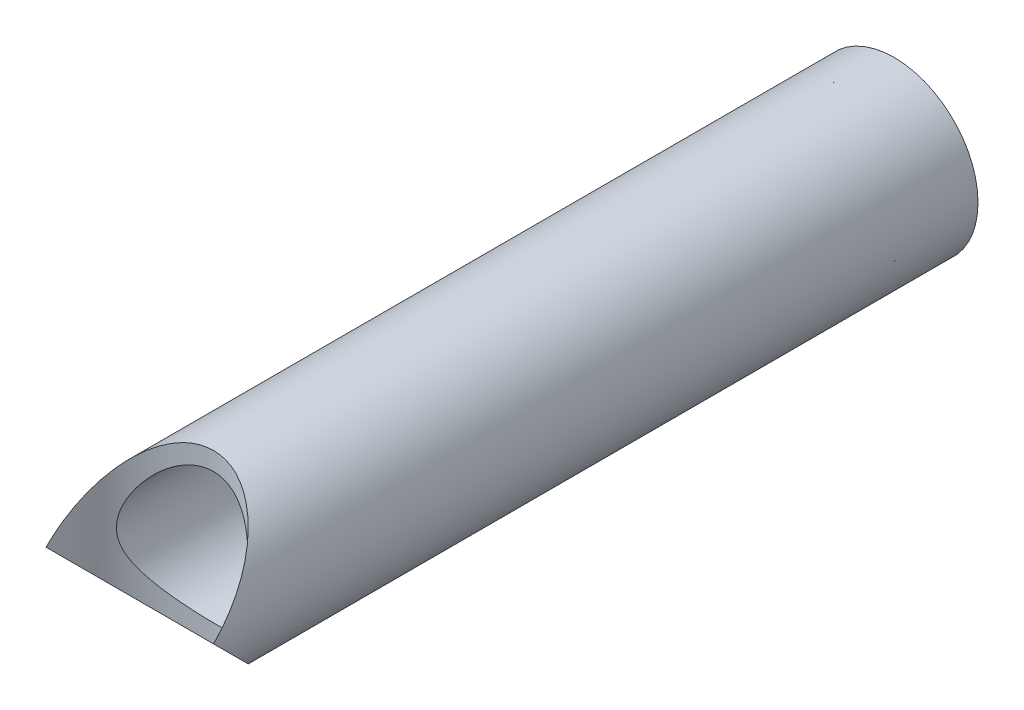
ISO-10303-21;
HEADER;
FILE_DESCRIPTION(('STEP AP214'),'2;1');
FILE_NAME('part.step','',(''),(''),'','','');
FILE_SCHEMA(('AUTOMOTIVE_DESIGN { 1 0 10303 214 1 1 1 1 }'));
ENDSEC;
DATA;
#1=APPLICATION_CONTEXT('core data for automotive mechanical design processes');
#2=APPLICATION_PROTOCOL_DEFINITION('international standard','automotive_design',2000,#1);
#3=PRODUCT_CONTEXT('',#1,'mechanical');
#4=PRODUCT('Part','Part','',(#3));
#5=PRODUCT_RELATED_PRODUCT_CATEGORY('part','',(#4));
#6=PRODUCT_DEFINITION_FORMATION('','',#4);
#7=PRODUCT_DEFINITION_CONTEXT('part definition',#1,'design');
#8=PRODUCT_DEFINITION('design','',#6,#7);
#9=PRODUCT_DEFINITION_SHAPE('','',#8);
#10=(LENGTH_UNIT() NAMED_UNIT(*) SI_UNIT(.MILLI.,.METRE.));
#11=(NAMED_UNIT(*) PLANE_ANGLE_UNIT() SI_UNIT($,.RADIAN.));
#12=(NAMED_UNIT(*) SI_UNIT($,.STERADIAN.) SOLID_ANGLE_UNIT());
#13=UNCERTAINTY_MEASURE_WITH_UNIT(LENGTH_MEASURE(1.E-05),#10,'distance_accuracy_value','');
#14=(GEOMETRIC_REPRESENTATION_CONTEXT(3) GLOBAL_UNCERTAINTY_ASSIGNED_CONTEXT((#13)) GLOBAL_UNIT_ASSIGNED_CONTEXT((#10,
#11,#12)) REPRESENTATION_CONTEXT('',''));
#15=CARTESIAN_POINT('',(0.,0.,0.));
#16=DIRECTION('',(0.,0.,1.));
#17=DIRECTION('',(1.,0.,0.));
#18=AXIS2_PLACEMENT_3D('',#15,#16,#17);
#19=CARTESIAN_POINT('',(0.,0.,0.));
#20=DIRECTION('',(0.,0.,1.));
#21=DIRECTION('',(1.,0.,0.));
#22=AXIS2_PLACEMENT_3D('',#19,#20,#21);
#23=CYLINDRICAL_SURFACE('',#22,13.0683);
#24=CARTESIAN_POINT('',(0.,0.,0.));
#25=DIRECTION('',(0.,0.,-1.));
#26=DIRECTION('',(1.,0.,0.));
#27=AXIS2_PLACEMENT_3D('',#24,#25,#26);
#28=CIRCLE('',#27,13.0683);
#29=CARTESIAN_POINT('',(13.0683,0.,0.));
#30=VERTEX_POINT('',#29);
#31=CARTESIAN_POINT('',(-13.0683,0.,0.));
#32=VERTEX_POINT('',#31);
#33=EDGE_CURVE('E52',#30,#32,#28,.T.);
#34=ORIENTED_EDGE('',*,*,#33,.T.);
#35=CARTESIAN_POINT('',(0.,0.,0.));
#36=DIRECTION('',(0.,0.,-1.));
#37=DIRECTION('',(-1.,0.,0.));
#38=AXIS2_PLACEMENT_3D('',#35,#36,#37);
#39=CIRCLE('',#38,13.0683);
#40=EDGE_CURVE('E50',#32,#30,#39,.T.);
#41=ORIENTED_EDGE('',*,*,#40,.T.);
#42=EDGE_LOOP('',(#34,#41));
#43=FACE_BOUND('',#42,.T.);
#44=CARTESIAN_POINT('',(3.36137327163763E-12,13.0683,135.6995));
#45=CARTESIAN_POINT('',(-0.31564780553952,13.0682969442648,135.699502969259));
#46=CARTESIAN_POINT('',(-0.631365008771418,13.056842753139,135.708470121774));
#47=CARTESIAN_POINT('',(-1.26028077621582,13.0112130982685,135.744139015985));
#48=CARTESIAN_POINT('',(-1.5734777792293,12.9770245058517,135.770851004967));
#49=CARTESIAN_POINT('',(-2.19534481022483,12.8864214411206,135.841458842086));
#50=CARTESIAN_POINT('',(-2.50400399603749,12.8299606179479,135.885390525));
#51=CARTESIAN_POINT('',(-3.11380537882932,12.6957534246509,135.989436448515));
#52=CARTESIAN_POINT('',(-3.41494850800069,12.6180097086339,136.049548671287));
#53=CARTESIAN_POINT('',(-4.00595259693765,12.4429577520778,136.18425671896));
#54=CARTESIAN_POINT('',(-4.29587320366963,12.3457772894036,136.258757846191));
#55=CARTESIAN_POINT('',(-4.86492993416844,12.1328163268632,136.421054002579));
#56=CARTESIAN_POINT('',(-5.14406595356887,12.0170356470519,136.508849160346));
#57=CARTESIAN_POINT('',(-5.69031348187373,11.7682136015384,136.696166691747));
#58=CARTESIAN_POINT('',(-5.95742862166305,11.6351774955834,136.79568549097));
#59=CARTESIAN_POINT('',(-6.47892014237298,11.3530605619995,137.004894668748));
#60=CARTESIAN_POINT('',(-6.73329396013967,11.203976524875,137.114587081359));
#61=CARTESIAN_POINT('',(-7.31223234219363,10.8381378046672,137.380983949751));
#62=CARTESIAN_POINT('',(-7.63155006646832,10.6155133742641,137.541070577886));
#63=CARTESIAN_POINT('',(-8.24547311458336,10.1460374956556,137.872760295247));
#64=CARTESIAN_POINT('',(-8.54007077997845,9.899178590464,138.044366924026));
#65=CARTESIAN_POINT('',(-9.10477595697104,9.38245112110175,138.395693278953));
#66=CARTESIAN_POINT('',(-9.37481652900868,9.11252333835956,138.575433291915));
#67=CARTESIAN_POINT('',(-9.88918263027681,8.55157007025901,138.938578776537));
#68=CARTESIAN_POINT('',(-10.133510915295,8.26054685152197,139.121983852872));
#69=CARTESIAN_POINT('',(-10.5993931775722,7.65386726760582,139.490738600406));
#70=CARTESIAN_POINT('',(-10.8205777741854,7.33792160620142,139.676079261557));
#71=CARTESIAN_POINT('',(-11.2355859425544,6.68518438670586,140.041009360853));
#72=CARTESIAN_POINT('',(-11.42940122959,6.34838656082913,140.220597044902));
#73=CARTESIAN_POINT('',(-11.7879460175653,5.65480664728864,140.567289588585));
#74=CARTESIAN_POINT('',(-11.9527504284089,5.2980792578665,140.734425935083));
#75=CARTESIAN_POINT('',(-12.2518791744831,4.56385593405592,141.048999452263));
#76=CARTESIAN_POINT('',(-12.3862295914749,4.18637811792706,141.196453434699));
#77=CARTESIAN_POINT('',(-12.5750560935809,3.56486571257676,141.409721166144));
#78=CARTESIAN_POINT('',(-12.6400970206891,3.32716405933401,141.484745147665));
#79=CARTESIAN_POINT('',(-12.7572707770035,2.84499670838633,141.621926155231));
#80=CARTESIAN_POINT('',(-12.809408625479,2.60053368211279,141.684088183));
#81=CARTESIAN_POINT('',(-12.8998453779524,2.10649497289366,141.793129176676));
#82=CARTESIAN_POINT('',(-12.9381865623535,1.85693742999744,141.840054791221));
#83=CARTESIAN_POINT('',(-13.0004871186682,1.3535247374254,141.916846370317));
#84=CARTESIAN_POINT('',(-13.0244556169586,1.09967242037962,141.946723159958));
#85=CARTESIAN_POINT('',(-13.0500620747704,0.704367963353698,141.978734766559));
#86=CARTESIAN_POINT('',(-13.0568951124878,0.563734221147244,141.987303372601));
#87=CARTESIAN_POINT('',(-13.066015590108,0.282076624535581,141.998750883677));
#88=CARTESIAN_POINT('',(-13.0683025231652,0.141052728387061,142.001629154296));
#89=CARTESIAN_POINT('',(-13.0682946581523,-0.298625785103751,142.001611300705));
#90=CARTESIAN_POINT('',(-13.0580275062785,-0.597380802184784,141.988672506161));
#91=CARTESIAN_POINT('',(-13.0172809420248,-1.19151526642505,141.937777479124));
#92=CARTESIAN_POINT('',(-12.986783216413,-1.48689140827512,141.899798579878));
#93=CARTESIAN_POINT('',(-12.9063421091523,-2.07231103930122,141.801081493142));
#94=CARTESIAN_POINT('',(-12.856319839576,-2.36232783117924,141.740251012926));
#95=CARTESIAN_POINT('',(-12.7380543838856,-2.93388475222846,141.599208239853));
#96=CARTESIAN_POINT('',(-12.6698025933016,-3.21542080841676,141.51898679602));
#97=CARTESIAN_POINT('',(-12.5461763890537,-3.66125403934763,141.377057694173));
#98=CARTESIAN_POINT('',(-12.496088619489,-3.82863570209849,141.32025245754));
#99=CARTESIAN_POINT('',(-12.3898633712997,-4.15955890512076,141.201592445757));
#100=CARTESIAN_POINT('',(-12.3337283278525,-4.32310195909032,141.139739705601));
#101=CARTESIAN_POINT('',(-12.1565275399193,-4.80810290194966,140.947671279435));
#102=CARTESIAN_POINT('',(-12.0266922649779,-5.12383921554589,140.810975930741));
#103=CARTESIAN_POINT('',(-11.7451465837632,-5.73993257030188,140.525723389227));
#104=CARTESIAN_POINT('',(-11.5934223437037,-6.04027972163225,140.377158721715));
#105=CARTESIAN_POINT('',(-11.2691749683943,-6.62556031042074,140.072719200988));
#106=CARTESIAN_POINT('',(-11.0966541807886,-6.91049548242836,139.916845174111));
#107=CARTESIAN_POINT('',(-10.7262447064065,-7.47293364606091,139.59703347216));
#108=CARTESIAN_POINT('',(-10.5277732368094,-7.74999349211534,139.432992587972));
#109=CARTESIAN_POINT('',(-10.1099134370845,-8.28770423264776,139.104625765304));
#110=CARTESIAN_POINT('',(-9.89052421472926,-8.54835442639909,138.940299814957));
#111=CARTESIAN_POINT('',(-9.43125525755181,-9.05251764445008,138.614597156252));
#112=CARTESIAN_POINT('',(-9.19138996045186,-9.29604252645507,138.453218465662));
#113=CARTESIAN_POINT('',(-8.69126604027603,-9.76523953752508,138.136191052004));
#114=CARTESIAN_POINT('',(-8.43100868316629,-9.99091277309879,137.980541974114));
#115=CARTESIAN_POINT('',(-7.90269160886927,-10.4133108834985,137.684646654151));
#116=CARTESIAN_POINT('',(-7.63552456386915,-10.6108854056376,137.544021860343));
#117=CARTESIAN_POINT('',(-7.08334887878585,-10.9871845115405,137.272956851186));
#118=CARTESIAN_POINT('',(-6.7983426102416,-11.1659115924298,137.142515287242));
#119=CARTESIAN_POINT('',(-6.21137507066658,-11.5027695684634,136.894291658284));
#120=CARTESIAN_POINT('',(-5.90942420970475,-11.6609129153918,136.776501947352));
#121=CARTESIAN_POINT('',(-5.28957802080575,-11.9548489529339,136.555909170406));
#122=CARTESIAN_POINT('',(-4.97168544230581,-12.090645480481,136.453103531983));
#123=CARTESIAN_POINT('',(-4.37171935268185,-12.318891758693,136.279307013));
#124=CARTESIAN_POINT('',(-4.09167000139884,-12.414796390822,136.205854795481));
#125=CARTESIAN_POINT('',(-3.52273449095137,-12.5880575222772,136.072650078347));
#126=CARTESIAN_POINT('',(-3.23384996377672,-12.665417424039,136.012895065769));
#127=CARTESIAN_POINT('',(-2.64901186733749,-12.8005166112199,135.908255535957));
#128=CARTESIAN_POINT('',(-2.35306160047254,-12.8582648777987,135.863364212125));
#129=CARTESIAN_POINT('',(-1.7559307699453,-12.9533224670306,135.78934355005));
#130=CARTESIAN_POINT('',(-1.45475014772709,-12.9906315607068,135.760214388387));
#131=CARTESIAN_POINT('',(-0.848445588864123,-13.0442901753827,135.718289678277));
#132=CARTESIAN_POINT('',(-0.543312343535124,-13.0605745796989,135.705544875217));
#133=CARTESIAN_POINT('',(0.0675867605515304,-13.0716955997113,135.696843141743));
#134=CARTESIAN_POINT('',(0.373352620634617,-13.0665321704252,135.700886246537));
#135=CARTESIAN_POINT('',(0.983120352512098,-13.0348440508523,135.72566948873));
#136=CARTESIAN_POINT('',(1.28712203471024,-13.0083171059325,135.746411388462));
#137=CARTESIAN_POINT('',(1.89099369342511,-12.9343396581425,135.804131752536));
#138=CARTESIAN_POINT('',(2.19086373691274,-12.8868894948351,135.841109953377));
#139=CARTESIAN_POINT('',(2.77060297518347,-12.7744803282548,135.928436833816));
#140=CARTESIAN_POINT('',(3.0507556617447,-12.7104329095573,135.978087798625));
#141=CARTESIAN_POINT('',(3.60375454323894,-12.5648386714092,136.090516036047));
#142=CARTESIAN_POINT('',(3.87660102046779,-12.4832925291712,136.15329280068));
#143=CARTESIAN_POINT('',(4.41364183376353,-12.3036744693156,136.290893588468));
#144=CARTESIAN_POINT('',(4.67783654277909,-12.2056032651608,136.365717091503));
#145=CARTESIAN_POINT('',(5.19660539862226,-11.9939268113875,136.526255746571));
#146=CARTESIAN_POINT('',(5.45117599484282,-11.8803158987558,136.611974868398));
#147=CARTESIAN_POINT('',(5.97537729842836,-11.6262054882184,136.802336982984));
#148=CARTESIAN_POINT('',(6.24387251429642,-11.4841430940847,136.908019250924));
#149=CARTESIAN_POINT('',(6.7673521426863,-11.1836731332719,137.129425036735));
#150=CARTESIAN_POINT('',(7.02233087203493,-11.0252587724294,137.245152725227));
#151=CARTESIAN_POINT('',(7.51825675091115,-10.6932395910639,137.48496013497));
#152=CARTESIAN_POINT('',(7.75919694842359,-10.5196273491222,137.60904392977));
#153=CARTESIAN_POINT('',(8.22650191929636,-10.1583631545659,137.86376335239));
#154=CARTESIAN_POINT('',(8.45287021153358,-9.97071461533043,137.994397384777));
#155=CARTESIAN_POINT('',(8.9357665214004,-9.54237771793472,138.287803623669));
#156=CARTESIAN_POINT('',(9.18897661325485,-9.29869737911008,138.451678518201));
#157=CARTESIAN_POINT('',(9.67380527379591,-8.79321570530231,138.783447810965));
#158=CARTESIAN_POINT('',(9.90542001652405,-8.53141117359315,138.951342914844));
#159=CARTESIAN_POINT('',(10.3469490904287,-7.99019302249321,139.288002978288));
#160=CARTESIAN_POINT('',(10.556845597608,-7.71076523779836,139.45676853484));
#161=CARTESIAN_POINT('',(10.954308658815,-7.13484361200697,139.791381364076));
#162=CARTESIAN_POINT('',(11.1418787125962,-6.83835245649441,139.957229090656));
#163=CARTESIAN_POINT('',(11.4677816427466,-6.2737747617432,140.257585819858));
#164=CARTESIAN_POINT('',(11.6092861929374,-6.00804213623112,140.393081159966));
#165=CARTESIAN_POINT('',(11.8750146485658,-5.46407508545593,140.655825917802));
#166=CARTESIAN_POINT('',(11.9992380052857,-5.18584026359024,140.783075073627));
#167=CARTESIAN_POINT('',(12.2292962944617,-4.61721973861089,141.025515080087));
#168=CARTESIAN_POINT('',(12.3351548671055,-4.32685026279119,141.140721355877));
#169=CARTESIAN_POINT('',(12.527382977472,-3.73392336801811,141.354996254377));
#170=CARTESIAN_POINT('',(12.6137578251822,-3.43136929634343,141.454069271906));
#171=CARTESIAN_POINT('',(12.7510062943901,-2.87372809830761,141.614478261923));
#172=CARTESIAN_POINT('',(12.8055080558348,-2.62057101822486,141.679407756826));
#173=CARTESIAN_POINT('',(12.8998045602244,-2.10793433579588,141.7930582949));
#174=CARTESIAN_POINT('',(12.9396016868935,-1.8484557654833,141.841781965021));
#175=CARTESIAN_POINT('',(13.0035753094257,-1.32541056026687,141.920671404583));
#176=CARTESIAN_POINT('',(13.0277901277568,-1.06185559977626,141.95088269377));
#177=CARTESIAN_POINT('',(13.0601538672831,-0.532207658816483,141.991361454328));
#178=CARTESIAN_POINT('',(13.0683020008264,-0.266114554560085,142.001627947926));
#179=CARTESIAN_POINT('',(13.0682977523581,0.298941600010746,142.001618347765));
#180=CARTESIAN_POINT('',(13.0580106011922,0.597910268814965,141.988651961476));
#181=CARTESIAN_POINT('',(13.017207382444,1.19230387725092,141.937685013321));
#182=CARTESIAN_POINT('',(12.9866875266984,1.48772814271757,141.899679763444));
#183=CARTESIAN_POINT('',(12.9062225288805,2.07303999689914,141.800936130446));
#184=CARTESIAN_POINT('',(12.8562107408035,2.36290497093408,141.740119779694));
#185=CARTESIAN_POINT('',(12.7379856829849,2.93416677021101,141.599127426573));
#186=CARTESIAN_POINT('',(12.6697640247615,3.21555962607535,141.518942503581));
#187=CARTESIAN_POINT('',(12.5461786763486,3.66124595721019,141.377060328558));
#188=CARTESIAN_POINT('',(12.4960934803285,3.82861950275147,141.320257972479));
#189=CARTESIAN_POINT('',(12.3898738191056,4.159527412667,141.201604031451));
#190=CARTESIAN_POINT('',(12.3337417722674,4.32306328023996,141.139754467455));
#191=CARTESIAN_POINT('',(12.1565565035085,4.80802739231456,140.947702295194));
#192=CARTESIAN_POINT('',(12.02673566216,5.12373529231011,140.811021350693));
#193=CARTESIAN_POINT('',(11.7452003095866,5.73982397073153,140.525776369451));
#194=CARTESIAN_POINT('',(11.5934684872021,6.0401923735072,140.377202978632));
#195=CARTESIAN_POINT('',(11.2692013457305,6.62551675317796,140.072743034951));
#196=CARTESIAN_POINT('',(11.0966681383198,6.91047429027766,139.916857225398));
#197=CARTESIAN_POINT('',(10.7262382023385,7.47294352066721,139.597027856186));
#198=CARTESIAN_POINT('',(10.5277594938107,7.75001267866947,139.432981229814));
#199=CARTESIAN_POINT('',(10.1098842438606,8.28774029728535,139.104603383071));
#200=CARTESIAN_POINT('',(9.89048685707299,8.54839809397604,138.940272151463));
#201=CARTESIAN_POINT('',(9.43121518290503,9.05255898147539,138.614569903909));
#202=CARTESIAN_POINT('',(9.19135667378726,9.29607503104374,138.453196721517));
#203=CARTESIAN_POINT('',(8.69124810567226,9.76525508688709,138.136180327122));
#204=CARTESIAN_POINT('',(8.43099935003906,9.99092023235888,137.980536749811));
#205=CARTESIAN_POINT('',(7.90276196554676,10.4132546347909,137.684686056137));
#206=CARTESIAN_POINT('',(7.63567030289562,10.6107776319754,137.544098564058));
#207=CARTESIAN_POINT('',(7.08361127947601,10.9870141361177,137.27308050964));
#208=CARTESIAN_POINT('',(6.79864346433928,11.1657271646624,137.142650205662));
#209=CARTESIAN_POINT('',(6.21166037281008,11.5026175839761,136.894404630177));
#210=CARTESIAN_POINT('',(5.90964989980054,11.6608007199194,136.776585831035));
#211=CARTESIAN_POINT('',(5.28968877171061,11.9548015994657,136.555945024658));
#212=CARTESIAN_POINT('',(4.97174148424563,12.090624042344,136.453119866912));
#213=CARTESIAN_POINT('',(4.37276977744862,12.3184922429555,136.279611212162));
#214=CARTESIAN_POINT('',(4.09381050493677,12.4140634782819,136.206416085422));
#215=CARTESIAN_POINT('',(3.52711249026061,12.5868043521595,136.073615684011));
#216=CARTESIAN_POINT('',(3.23937529932706,12.6639772210581,136.014008023762));
#217=CARTESIAN_POINT('',(2.65738401671252,12.7987423807872,135.909632218031));
#218=CARTESIAN_POINT('',(2.36314553103273,12.856377069044,135.864831946197));
#219=CARTESIAN_POINT('',(1.76959286456039,12.951418903898,135.790828047905));
#220=CARTESIAN_POINT('',(1.47028134738084,12.9888363458368,135.761616483216));
#221=CARTESIAN_POINT('',(0.975438578513692,13.0333031988691,135.726874365648));
#222=CARTESIAN_POINT('',(0.780753926935836,13.0464165998793,135.716619313547));
#223=CARTESIAN_POINT('',(0.390721783708617,13.0639166845106,135.702930634628));
#224=CARTESIAN_POINT('',(0.195374185493276,13.0683018913858,135.69949816214));
#225=CARTESIAN_POINT('',(3.36137327163763E-12,13.0683,135.6995));
#226=B_SPLINE_CURVE_WITH_KNOTS('',3,(#44,#45,#46,#47,#48,#49,#50,#51,#52,#53,#54,#55,#56,#57,
#58,#59,#60,#61,#62,#63,#64,#65,#66,#67,#68,#69,#70,#71,#72,#73,#74,#75,#76,#77,#78,#79,#80,#81,
#82,#83,#84,#85,#86,#87,#88,#89,#90,#91,#92,#93,#94,#95,#96,#97,#98,#99,#100,#101,#102,#103,
#104,#105,#106,#107,#108,#109,#110,#111,#112,#113,#114,#115,#116,#117,#118,#119,#120,#121,#122,
#123,#124,#125,#126,#127,#128,#129,#130,#131,#132,#133,#134,#135,#136,#137,#138,#139,#140,#141,
#142,#143,#144,#145,#146,#147,#148,#149,#150,#151,#152,#153,#154,#155,#156,#157,#158,#159,#160,
#161,#162,#163,#164,#165,#166,#167,#168,#169,#170,#171,#172,#173,#174,#175,#176,#177,#178,#179,
#180,#181,#182,#183,#184,#185,#186,#187,#188,#189,#190,#191,#192,#193,#194,#195,#196,#197,#198,
#199,#200,#201,#202,#203,#204,#205,#206,#207,#208,#209,#210,#211,#212,#213,#214,#215,#216,#217,
#218,#219,#220,#221,#222,#223,#224,#225),.UNSPECIFIED.,.T.,.F.,(4,2,2,2,2,2,2,2,2,2,2,2,2,2,2,2,
2,2,2,2,2,2,2,2,2,2,2,2,2,2,2,2,2,2,2,2,2,2,2,2,2,2,2,2,2,2,2,2,2,2,2,2,2,2,2,2,2,2,2,2,2,2,2,2,
2,2,2,2,2,2,2,2,2,2,2,2,2,2,2,2,2,2,2,2,2,2,2,2,2,2,4),(0.,0.946731973431358,1.89401114139912,
2.84327218651215,3.79241490682647,4.73551171524552,5.67861764807376,6.62143677881941,
7.56444481963769,8.82535960973664,10.0866636086784,11.3513086998227,12.6158181106852,
13.8981438034004,15.1808568292663,16.4602075215635,17.7384583626554,18.5106617429723,
19.2825642640337,20.0520806993238,20.8211079877672,21.2441168426276,21.6671728561305,
22.562833901612,23.4593068307709,24.3594400466601,25.2599988852871,25.8109574410434,
26.3616949547545,27.4634737417049,28.5659519262844,29.6683057725795,30.8020715734353,
31.9358857556813,33.0689069841991,34.2018579289027,35.283300386065,36.3645993808134,
37.4452411913329,38.5256972623631,39.4397429879344,40.3536208832891,41.2670797015929,
42.1805487530308,43.0968402243717,44.0131336174419,44.9295237256848,45.845898962384,
46.7198792125979,47.5938256452722,48.46773435533,49.3419623897686,50.3059063303092,
51.2702524095148,52.2350720527953,53.1996578270507,54.3617917423043,55.5241311583334,
56.6874170553421,57.8505203622064,58.8402475471919,59.830006151126,60.8184810726085,
61.8066862741977,62.6067442941645,63.4066725621756,64.2046259249088,65.0026184054754,
65.8990487015615,66.7956468834483,67.695337957149,68.5954441961463,69.1463760435694,
69.6970883648232,70.7987630721134,71.9013129881128,73.0037510715789,74.1375561132504,
75.2714069936638,76.4043912933405,77.5373032305712,78.6184509004555,79.6996260616239,
80.7804980066483,81.8611425071773,82.7716980366712,83.6820935747545,84.590500735789,
85.4984448665222,86.0843374273043,86.6703291083435),.UNSPECIFIED.);
#227=CARTESIAN_POINT('',(3.36137327163763E-12,13.0683,135.6995));
#228=VERTEX_POINT('',#227);
#229=EDGE_CURVE('E102',#228,#228,#226,.T.);
#230=ORIENTED_EDGE('',*,*,#229,.T.);
#231=EDGE_LOOP('',(#230));
#232=FACE_BOUND('',#231,.T.);
#233=ADVANCED_FACE('F17',(#43,#232),#23,.F.);
#234=CARTESIAN_POINT('',(0.,0.,0.));
#235=DIRECTION('',(0.,0.,1.));
#236=DIRECTION('',(1.,0.,0.));
#237=AXIS2_PLACEMENT_3D('',#234,#235,#236);
#238=PLANE('',#237);
#239=ORIENTED_EDGE('',*,*,#33,.F.);
#240=ORIENTED_EDGE('',*,*,#40,.F.);
#241=EDGE_LOOP('',(#239,#240));
#242=FACE_BOUND('',#241,.T.);
#243=CARTESIAN_POINT('',(0.,0.,0.));
#244=DIRECTION('',(0.,0.,1.));
#245=DIRECTION('',(1.,0.,0.));
#246=AXIS2_PLACEMENT_3D('',#243,#244,#245);
#247=CIRCLE('',#246,16.7005);
#248=CARTESIAN_POINT('',(16.7005,0.,0.));
#249=VERTEX_POINT('',#248);
#250=CARTESIAN_POINT('',(-16.7005,0.,0.));
#251=VERTEX_POINT('',#250);
#252=EDGE_CURVE('E28',#249,#251,#247,.T.);
#253=ORIENTED_EDGE('',*,*,#252,.F.);
#254=CARTESIAN_POINT('',(0.,0.,0.));
#255=DIRECTION('',(0.,0.,1.));
#256=DIRECTION('',(-1.,0.,0.));
#257=AXIS2_PLACEMENT_3D('',#254,#255,#256);
#258=CIRCLE('',#257,16.7005);
#259=EDGE_CURVE('E62',#251,#249,#258,.T.);
#260=ORIENTED_EDGE('',*,*,#259,.F.);
#261=EDGE_LOOP('',(#253,#260));
#262=FACE_BOUND('',#261,.T.);
#263=ADVANCED_FACE('F60',(#242,#262),#238,.F.);
#264=CARTESIAN_POINT('',(0.,-20.2057,152.4));
#265=DIRECTION('',(0.,1.,0.));
#266=DIRECTION('',(0.,0.,1.));
#267=AXIS2_PLACEMENT_3D('',#264,#265,#266);
#268=CYLINDRICAL_SURFACE('',#267,16.7005);
#269=ORIENTED_EDGE('',*,*,#229,.F.);
#270=EDGE_LOOP('',(#269));
#271=FACE_BOUND('',#270,.T.);
#272=CARTESIAN_POINT('',(0.,0.,152.4));
#273=DIRECTION('',(0.,0.707106781186547,0.707106781186547));
#274=DIRECTION('',(0.,-0.707106781186547,0.707106781186547));
#275=AXIS2_PLACEMENT_3D('',#272,#273,#274);
#276=ELLIPSE('',#275,23.6180735984119,16.7005);
#277=CARTESIAN_POINT('',(-16.7005,0.,152.4));
#278=VERTEX_POINT('',#277);
#279=CARTESIAN_POINT('',(16.7005,0.,152.4));
#280=VERTEX_POINT('',#279);
#281=EDGE_CURVE('E11',#278,#280,#276,.F.);
#282=ORIENTED_EDGE('',*,*,#281,.F.);
#283=CARTESIAN_POINT('',(16.7005,0.,152.4));
#284=CARTESIAN_POINT('',(16.700462175787,-0.391208788227068,152.009212815702));
#285=CARTESIAN_POINT('',(16.6867567913032,-0.782147255429364,151.618227892806));
#286=CARTESIAN_POINT('',(16.6397053557203,-1.45083367442482,150.949326577069));
#287=CARTESIAN_POINT('',(16.6131306057088,-1.72884371930703,150.671186957333));
#288=CARTESIAN_POINT('',(16.5375152977868,-2.35359753534769,150.046368291525));
#289=CARTESIAN_POINT('',(16.4845174195093,-2.70013538540419,149.699951890536));
#290=CARTESIAN_POINT('',(16.3633756652827,-3.35330763899423,149.046774007267));
#291=CARTESIAN_POINT('',(16.2975166990672,-3.6601685169547,148.739811733138));
#292=CARTESIAN_POINT('',(16.1404163082867,-4.30276467473981,148.09725913259));
#293=CARTESIAN_POINT('',(16.0472821175806,-4.63828333246483,147.761911365252));
#294=CARTESIAN_POINT('',(15.8450102159953,-5.28688085913591,147.113593725966));
#295=CARTESIAN_POINT('',(15.7370844488284,-5.60015038519697,146.80043616506));
#296=CARTESIAN_POINT('',(15.5085152647177,-6.20407347676933,146.196495511722));
#297=CARTESIAN_POINT('',(15.3890292358604,-6.49495283501745,145.905500764447));
#298=CARTESIAN_POINT('',(15.1404071464386,-7.05424354304271,145.345941246712));
#299=CARTESIAN_POINT('',(15.0123770408858,-7.32290203158835,145.077132241895));
#300=CARTESIAN_POINT('',(14.733717570366,-7.86909787714561,144.530881017366));
#301=CARTESIAN_POINT('',(14.582297025506,-8.14644013021035,144.253646075067));
#302=CARTESIAN_POINT('',(14.2679228604067,-8.68483358134901,143.71540006728));
#303=CARTESIAN_POINT('',(14.1056753220892,-8.94609205147871,143.45418425132));
#304=CARTESIAN_POINT('',(13.7713381804271,-9.4522525681933,142.948010155062));
#305=CARTESIAN_POINT('',(13.5999364035542,-9.69738346539476,142.702827054328));
#306=CARTESIAN_POINT('',(13.2489144073254,-10.1713401518949,142.22874266941));
#307=CARTESIAN_POINT('',(13.0699635692752,-10.4004140076755,141.999594415665));
#308=CARTESIAN_POINT('',(12.702198055161,-10.8462928216191,141.553692450519));
#309=CARTESIAN_POINT('',(12.5137862752335,-11.063261991245,141.336771151496));
#310=CARTESIAN_POINT('',(12.1289045855405,-11.4836818336429,140.916418359901));
#311=CARTESIAN_POINT('',(11.9328935656483,-11.6873427396415,140.712777513443));
#312=CARTESIAN_POINT('',(11.5338439862942,-12.0811052113657,140.319005806879));
#313=CARTESIAN_POINT('',(11.3312498189645,-12.2714324423716,140.128650885985));
#314=CARTESIAN_POINT('',(10.9200316759668,-12.6385527200537,139.761468980654));
#315=CARTESIAN_POINT('',(10.7118363285025,-12.8155855376965,139.584402465327));
#316=CARTESIAN_POINT('',(10.2952571167631,-13.1522613189242,139.247726914672));
#317=CARTESIAN_POINT('',(10.0875511377316,-13.3123213852106,139.087697056299));
#318=CARTESIAN_POINT('',(9.66679286353755,-13.6207947206715,138.779263847944));
#319=CARTESIAN_POINT('',(9.45402841170161,-13.7694042866057,138.630664717989));
#320=CARTESIAN_POINT('',(9.02384575715304,-14.0549558151146,138.345106092445));
#321=CARTESIAN_POINT('',(8.80669894141066,-14.1921022850819,138.207942820985));
#322=CARTESIAN_POINT('',(8.36842716478202,-14.4547455415491,137.94526511466));
#323=CARTESIAN_POINT('',(8.1475556818963,-14.5804534628021,137.819539578784));
#324=CARTESIAN_POINT('',(7.7105390205602,-14.8159388702727,137.584062583632));
#325=CARTESIAN_POINT('',(7.49493912383778,-14.9262206310311,137.473804231449));
#326=CARTESIAN_POINT('',(7.06035125392838,-15.1365528171359,137.263504867553));
#327=CARTESIAN_POINT('',(6.84152001398809,-15.2367650690558,137.163302302758));
#328=CARTESIAN_POINT('',(6.40097410640789,-15.4269459417602,136.973122284448));
#329=CARTESIAN_POINT('',(6.17939916272974,-15.5170763664959,136.882983384891));
#330=CARTESIAN_POINT('',(5.73386571821981,-15.6871051034624,136.712917663512));
#331=CARTESIAN_POINT('',(5.51002930626471,-15.7671632602306,136.632831374833));
#332=CARTESIAN_POINT('',(5.07020254093918,-15.9138358722056,136.486159786107));
#333=CARTESIAN_POINT('',(4.85456109101841,-15.9809714706138,136.419049967971));
#334=CARTESIAN_POINT('',(4.42113647827324,-16.1062260270481,136.293885325579));
#335=CARTESIAN_POINT('',(4.20341102100115,-16.1644444765542,136.235730540833));
#336=CARTESIAN_POINT('',(3.76620712000147,-16.2718314167796,136.128459351725));
#337=CARTESIAN_POINT('',(3.54677385923848,-16.3210918831424,136.079251090684));
#338=CARTESIAN_POINT('',(3.10653620766565,-16.4105483282235,135.989866986855));
#339=CARTESIAN_POINT('',(2.88576545714481,-16.4508271553809,135.949608600095));
#340=CARTESIAN_POINT('',(2.44323327967356,-16.5223221778619,135.878113794402));
#341=CARTESIAN_POINT('',(2.22149517558689,-16.553610622086,135.846805461729));
#342=CARTESIAN_POINT('',(1.77740470009606,-16.6071433372411,135.793199810695));
#343=CARTESIAN_POINT('',(1.55506688082147,-16.6294479506782,135.770842377349));
#344=CARTESIAN_POINT('',(1.11014896932276,-16.6650474937721,135.735126476087));
#345=CARTESIAN_POINT('',(0.887576475267835,-16.6783897794224,135.721720710766));
#346=CARTESIAN_POINT('',(0.442555520010202,-16.69611472006,135.703894211963));
#347=CARTESIAN_POINT('',(0.220109750208132,-16.7005309381534,135.699439820586));
#348=CARTESIAN_POINT('',(-0.224970116127886,-16.7004687087596,135.699505094027));
#349=CARTESIAN_POINT('',(-0.447604210569784,-16.695982630091,135.70403245814));
#350=CARTESIAN_POINT('',(-0.893015328932755,-16.6781022412149,135.722024557858));
#351=CARTESIAN_POINT('',(-1.11578956953292,-16.6646735116086,135.735523825054));
#352=CARTESIAN_POINT('',(-1.56112351580415,-16.6288835049405,135.771444788104));
#353=CARTESIAN_POINT('',(-1.78367544202386,-16.6064739666946,135.793914687928));
#354=CARTESIAN_POINT('',(-2.22820546036657,-16.5527120164057,135.847763690167));
#355=CARTESIAN_POINT('',(-2.45016872326865,-16.5212983193751,135.879203839782));
#356=CARTESIAN_POINT('',(-2.89316116877124,-16.4495316708186,135.950980660078));
#357=CARTESIAN_POINT('',(-3.11416665276424,-16.4091055029994,135.991390184464));
#358=CARTESIAN_POINT('',(-3.55488231328513,-16.3193315474232,136.081094620768));
#359=CARTESIAN_POINT('',(-3.77455837663569,-16.269899930769,136.130473006869));
#360=CARTESIAN_POINT('',(-4.21225435784955,-16.1621464063388,136.238103838869));
#361=CARTESIAN_POINT('',(-4.43022852054677,-16.1037315428664,136.296449066152));
#362=CARTESIAN_POINT('',(-4.86415671255454,-15.9780578696799,136.422008959737));
#363=CARTESIAN_POINT('',(-5.08005239229661,-15.9106985920375,136.489324419993));
#364=CARTESIAN_POINT('',(-5.52020334706665,-15.7636062222277,136.636386863029));
#365=CARTESIAN_POINT('',(-5.74411272929413,-15.683357775103,136.716653062359));
#366=CARTESIAN_POINT('',(-6.18988404588543,-15.5129007093405,136.887143400307));
#367=CARTESIAN_POINT('',(-6.41162023470664,-15.4225279526214,136.977531626544));
#368=CARTESIAN_POINT('',(-6.85257531482113,-15.2318019384472,137.168271456733));
#369=CARTESIAN_POINT('',(-7.07165056660208,-15.1312826834546,137.268788702462));
#370=CARTESIAN_POINT('',(-7.5068074407723,-14.9202628452554,137.479775029853));
#371=CARTESIAN_POINT('',(-7.72272821551209,-14.8095963390231,137.590409412793));
#372=CARTESIAN_POINT('',(-8.15981656273371,-14.5735927773668,137.826384598292));
#373=CARTESIAN_POINT('',(-8.3804587462784,-14.4477707477973,137.952212760416));
#374=CARTESIAN_POINT('',(-8.81832608643942,-14.1848792943201,138.215131221389));
#375=CARTESIAN_POINT('',(-9.03529494998351,-14.0475969980518,138.352434789157));
#376=CARTESIAN_POINT('',(-9.46517358582506,-13.7617452045668,138.638304388881));
#377=CARTESIAN_POINT('',(-9.67780917681872,-13.6129694874282,138.787075946888));
#378=CARTESIAN_POINT('',(-10.0983566218229,-13.3041276315555,139.095884449734));
#379=CARTESIAN_POINT('',(-10.3059778115081,-13.1438635262138,139.256118675938));
#380=CARTESIAN_POINT('',(-10.7220714872673,-12.8070165390726,139.592963211221));
#381=CARTESIAN_POINT('',(-10.9298829124507,-12.6300275069641,139.769983126145));
#382=CARTESIAN_POINT('',(-11.3403554617093,-12.2630111155053,140.137060432243));
#383=CARTESIAN_POINT('',(-11.5425879836925,-12.0727444499836,140.327357062925));
#384=CARTESIAN_POINT('',(-11.9409378153097,-11.679116644545,140.72099882524));
#385=CARTESIAN_POINT('',(-12.1366108607945,-11.4755302237627,140.924567633807));
#386=CARTESIAN_POINT('',(-12.5208401963056,-11.0552708306462,141.344763318498));
#387=CARTESIAN_POINT('',(-12.7089377738163,-10.8383879532967,141.561599164234));
#388=CARTESIAN_POINT('',(-13.0760541539537,-10.3927461684932,142.007263521535));
#389=CARTESIAN_POINT('',(-13.2546737759407,-10.1638247375913,142.23625784404));
#390=CARTESIAN_POINT('',(-13.6050420168186,-9.6902084769328,142.709999239559));
#391=CARTESIAN_POINT('',(-13.7761233603275,-9.44526665207592,142.954992235194));
#392=CARTESIAN_POINT('',(-14.1098331814373,-8.9395203634085,143.46075052719));
#393=CARTESIAN_POINT('',(-14.2717760289939,-8.67848802523784,143.721739694962));
#394=CARTESIAN_POINT('',(-14.5855592517908,-8.14058335337088,144.259496974379));
#395=CARTESIAN_POINT('',(-14.7366958168404,-7.86350463391379,144.536468998724));
#396=CARTESIAN_POINT('',(-15.0148597660302,-7.31779783076616,145.082231608945));
#397=CARTESIAN_POINT('',(-15.1426741574958,-7.04936365057357,145.350816190015));
#398=CARTESIAN_POINT('',(-15.3908753424334,-6.49056108393197,145.909887165255));
#399=CARTESIAN_POINT('',(-15.5101592253254,-6.1999464316358,146.200616912566));
#400=CARTESIAN_POINT('',(-15.7383423777338,-5.59659325626425,146.803987909661));
#401=CARTESIAN_POINT('',(-15.8460874626221,-5.28362974081009,147.116840080126));
#402=CARTESIAN_POINT('',(-16.0480247651341,-4.63568466930996,147.764507134937));
#403=CARTESIAN_POINT('',(-16.1410084191524,-4.30051312532579,148.099509076584));
#404=CARTESIAN_POINT('',(-16.2978844944567,-3.6585083103668,148.741471614625));
#405=CARTESIAN_POINT('',(-16.3636611477273,-3.35189059854228,149.048190883841));
#406=CARTESIAN_POINT('',(-16.4846535112136,-2.69926402440184,149.70082331649));
#407=CARTESIAN_POINT('',(-16.5375896760452,-2.35302927979227,150.046936684579));
#408=CARTESIAN_POINT('',(-16.6131525916529,-1.72862495144104,150.671405652301));
#409=CARTESIAN_POINT('',(-16.6397196928676,-1.45066037485101,150.949499736858));
#410=CARTESIAN_POINT('',(-16.6867597916132,-0.78206195600731,151.618313002574));
#411=CARTESIAN_POINT('',(-16.7004621939023,-0.39116608591159,152.009255378534));
#412=CARTESIAN_POINT('',(-16.7005,0.,152.4));
#413=B_SPLINE_CURVE_WITH_KNOTS('',3,(#283,#284,#285,#286,#287,#288,#289,#290,#291,#292,#293,
#294,#295,#296,#297,#298,#299,#300,#301,#302,#303,#304,#305,#306,#307,#308,#309,#310,#311,#312,
#313,#314,#315,#316,#317,#318,#319,#320,#321,#322,#323,#324,#325,#326,#327,#328,#329,#330,#331,
#332,#333,#334,#335,#336,#337,#338,#339,#340,#341,#342,#343,#344,#345,#346,#347,#348,#349,#350,
#351,#352,#353,#354,#355,#356,#357,#358,#359,#360,#361,#362,#363,#364,#365,#366,#367,#368,#369,
#370,#371,#372,#373,#374,#375,#376,#377,#378,#379,#380,#381,#382,#383,#384,#385,#386,#387,#388,
#389,#390,#391,#392,#393,#394,#395,#396,#397,#398,#399,#400,#401,#402,#403,#404,#405,#406,#407,
#408,#409,#410,#411,#412),.UNSPECIFIED.,.F.,.F.,(4,2,2,2,2,2,2,2,2,2,2,2,2,2,2,2,2,2,2,2,2,2,2,
2,2,2,2,2,2,2,2,2,2,2,2,2,2,2,2,2,2,2,2,2,2,2,2,2,2,2,2,2,2,2,2,2,2,2,2,2,2,2,2,2,4),(0.,
1.65857584015276,2.84080695714124,4.31882657980268,5.63550254253885,7.08526803171106,
8.45255215253723,9.73749076803946,10.9402480187863,12.2009008687639,13.4109951584751,
14.5708731335974,15.6809235354823,16.7606558197899,17.8054037490098,18.8157259218492,
19.7922400254339,20.7134732003171,21.6102765523733,22.4833907721609,23.3336184658155,
24.1315360095156,24.9133144764189,25.679828653108,26.432006585686,27.1385103471506,
27.8364444325961,28.5267487833215,29.2103948116065,29.8883825502271,30.5617372426699,
31.2315054087914,31.8987504442013,32.566567699071,33.2369702895427,33.911024870119,
34.589780878372,35.2742661278301,35.9654828749782,36.6644044178999,37.3719722602836,
38.1246993198719,38.8921518914119,39.6752610867419,40.4749033270032,41.3248846887666,
42.1979916078597,43.0950255244754,44.0167254639075,44.9923578285608,46.0018278338788,
47.0457500370778,48.1246801173535,49.2336828938362,50.3924154099638,51.601264365646,
52.8605702518576,54.0622199273039,55.3459116381935,56.7118087792085,58.1600466140648,
59.4756666957254,60.9523895177875,62.1344265646992,63.7928217533211),.UNSPECIFIED.);
#414=EDGE_CURVE('E35',#280,#278,#413,.T.);
#415=ORIENTED_EDGE('',*,*,#414,.F.);
#416=EDGE_LOOP('',(#282,#415));
#417=FACE_BOUND('',#416,.T.);
#418=ADVANCED_FACE('F76',(#271,#417),#268,.F.);
#419=CARTESIAN_POINT('',(0.,0.,0.));
#420=DIRECTION('',(0.,0.,1.));
#421=DIRECTION('',(1.,0.,0.));
#422=AXIS2_PLACEMENT_3D('',#419,#420,#421);
#423=CYLINDRICAL_SURFACE('',#422,16.7005);
#424=ORIENTED_EDGE('',*,*,#259,.T.);
#425=ORIENTED_EDGE('',*,*,#252,.T.);
#426=EDGE_LOOP('',(#424,#425));
#427=FACE_BOUND('',#426,.T.);
#428=ORIENTED_EDGE('',*,*,#281,.T.);
#429=ORIENTED_EDGE('',*,*,#414,.T.);
#430=EDGE_LOOP('',(#428,#429));
#431=FACE_BOUND('',#430,.T.);
#432=ADVANCED_FACE('F107',(#427,#431),#423,.T.);
#433=CLOSED_SHELL('',(#233,#263,#418,#432));
#434=MANIFOLD_SOLID_BREP('B1',#433);
#435=ADVANCED_BREP_SHAPE_REPRESENTATION('',(#18,#434),#14);
#436=SHAPE_DEFINITION_REPRESENTATION(#9,#435);
ENDSEC;
END-ISO-10303-21;
